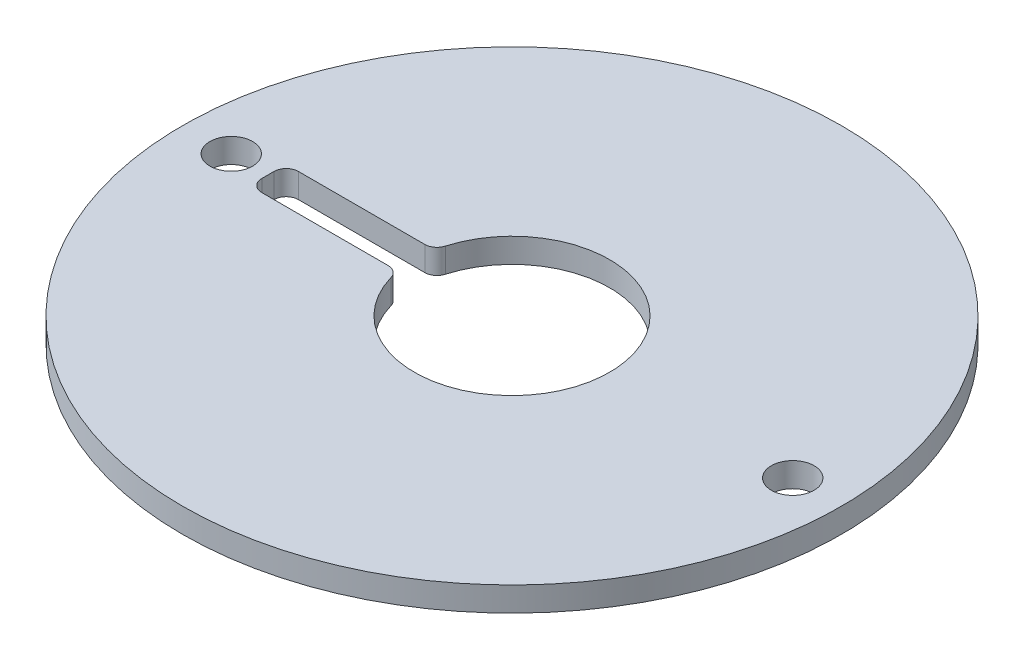
ISO-10303-21;
HEADER;
FILE_DESCRIPTION(('STEP AP214'),'2;1');
FILE_NAME('part.step','',(''),(''),'','','');
FILE_SCHEMA(('AUTOMOTIVE_DESIGN { 1 0 10303 214 1 1 1 1 }'));
ENDSEC;
DATA;
#1=APPLICATION_CONTEXT('core data for automotive mechanical design processes');
#2=APPLICATION_PROTOCOL_DEFINITION('international standard','automotive_design',2000,#1);
#3=PRODUCT_CONTEXT('',#1,'mechanical');
#4=PRODUCT('Part','Part','',(#3));
#5=PRODUCT_RELATED_PRODUCT_CATEGORY('part','',(#4));
#6=PRODUCT_DEFINITION_FORMATION('','',#4);
#7=PRODUCT_DEFINITION_CONTEXT('part definition',#1,'design');
#8=PRODUCT_DEFINITION('design','',#6,#7);
#9=PRODUCT_DEFINITION_SHAPE('','',#8);
#10=(LENGTH_UNIT() NAMED_UNIT(*) SI_UNIT(.MILLI.,.METRE.));
#11=(NAMED_UNIT(*) PLANE_ANGLE_UNIT() SI_UNIT($,.RADIAN.));
#12=(NAMED_UNIT(*) SI_UNIT($,.STERADIAN.) SOLID_ANGLE_UNIT());
#13=UNCERTAINTY_MEASURE_WITH_UNIT(LENGTH_MEASURE(1.E-05),#10,'distance_accuracy_value','');
#14=(GEOMETRIC_REPRESENTATION_CONTEXT(3) GLOBAL_UNCERTAINTY_ASSIGNED_CONTEXT((#13)) GLOBAL_UNIT_ASSIGNED_CONTEXT((#10,
#11,#12)) REPRESENTATION_CONTEXT('',''));
#15=CARTESIAN_POINT('',(0.,0.,0.));
#16=DIRECTION('',(0.,0.,1.));
#17=DIRECTION('',(1.,0.,0.));
#18=AXIS2_PLACEMENT_3D('',#15,#16,#17);
#19=CARTESIAN_POINT('',(0.,2.,0.));
#20=DIRECTION('',(0.,1.,0.));
#21=DIRECTION('',(0.,0.,1.));
#22=AXIS2_PLACEMENT_3D('',#19,#20,#21);
#23=PLANE('',#22);
#24=CARTESIAN_POINT('',(0.,2.,0.));
#25=DIRECTION('',(0.,1.,0.));
#26=DIRECTION('',(0.,0.,1.));
#27=AXIS2_PLACEMENT_3D('',#24,#25,#26);
#28=CIRCLE('',#27,8.);
#29=CARTESIAN_POINT('',(-7.6851628736847,2.,2.22222222222222));
#30=VERTEX_POINT('',#29);
#31=CARTESIAN_POINT('',(-7.6851628736847,2.,-2.22222222222222));
#32=VERTEX_POINT('',#31);
#33=EDGE_CURVE('E184',#30,#32,#28,.T.);
#34=ORIENTED_EDGE('',*,*,#33,.F.);
#35=CARTESIAN_POINT('',(-8.64580823289529,2.,2.5));
#36=DIRECTION('',(0.,1.,0.));
#37=DIRECTION('',(0.,0.,1.));
#38=AXIS2_PLACEMENT_3D('',#35,#36,#37);
#39=CIRCLE('',#38,1.);
#40=CARTESIAN_POINT('',(-8.64580823289529,2.,1.5));
#41=VERTEX_POINT('',#40);
#42=EDGE_CURVE('E139',#30,#41,#39,.T.);
#43=ORIENTED_EDGE('',*,*,#42,.T.);
#44=DIRECTION('',(1.,0.,0.));
#45=VECTOR('',#44,1.);
#46=CARTESIAN_POINT('',(-20.,2.,1.5));
#47=LINE('',#46,#45);
#48=CARTESIAN_POINT('',(-19.,2.,1.5));
#49=VERTEX_POINT('',#48);
#50=EDGE_CURVE('E161',#49,#41,#47,.T.);
#51=ORIENTED_EDGE('',*,*,#50,.F.);
#52=CARTESIAN_POINT('',(-19.,2.,0.5));
#53=DIRECTION('',(0.,1.,0.));
#54=DIRECTION('',(0.,0.,1.));
#55=AXIS2_PLACEMENT_3D('',#52,#53,#54);
#56=CIRCLE('',#55,1.);
#57=CARTESIAN_POINT('',(-20.,2.,0.5));
#58=VERTEX_POINT('',#57);
#59=EDGE_CURVE('E48',#49,#58,#56,.F.);
#60=ORIENTED_EDGE('',*,*,#59,.T.);
#61=DIRECTION('',(0.,0.,1.));
#62=VECTOR('',#61,1.);
#63=CARTESIAN_POINT('',(-20.,2.,-1.5));
#64=LINE('',#63,#62);
#65=CARTESIAN_POINT('',(-20.,2.,-0.5));
#66=VERTEX_POINT('',#65);
#67=EDGE_CURVE('E155',#66,#58,#64,.T.);
#68=ORIENTED_EDGE('',*,*,#67,.F.);
#69=CARTESIAN_POINT('',(-19.,2.,-0.5));
#70=DIRECTION('',(0.,1.,0.));
#71=DIRECTION('',(0.,0.,1.));
#72=AXIS2_PLACEMENT_3D('',#69,#70,#71);
#73=CIRCLE('',#72,1.);
#74=CARTESIAN_POINT('',(-19.,2.,-1.5));
#75=VERTEX_POINT('',#74);
#76=EDGE_CURVE('E41',#66,#75,#73,.F.);
#77=ORIENTED_EDGE('',*,*,#76,.T.);
#78=DIRECTION('',(-1.,0.,0.));
#79=VECTOR('',#78,1.);
#80=CARTESIAN_POINT('',(-20.,2.,-1.5));
#81=LINE('',#80,#79);
#82=CARTESIAN_POINT('',(-8.64580823289529,2.,-1.5));
#83=VERTEX_POINT('',#82);
#84=EDGE_CURVE('E154',#83,#75,#81,.T.);
#85=ORIENTED_EDGE('',*,*,#84,.F.);
#86=CARTESIAN_POINT('',(-8.64580823289529,2.,-2.5));
#87=DIRECTION('',(0.,1.,0.));
#88=DIRECTION('',(0.,0.,1.));
#89=AXIS2_PLACEMENT_3D('',#86,#87,#88);
#90=CIRCLE('',#89,1.);
#91=EDGE_CURVE('E137',#83,#32,#90,.T.);
#92=ORIENTED_EDGE('',*,*,#91,.T.);
#93=EDGE_LOOP('',(#34,#43,#51,#60,#68,#77,#85,#92));
#94=FACE_BOUND('',#93,.T.);
#95=CARTESIAN_POINT('',(-23.,2.,0.));
#96=DIRECTION('',(0.,1.,0.));
#97=DIRECTION('',(0.,0.,1.));
#98=AXIS2_PLACEMENT_3D('',#95,#96,#97);
#99=CIRCLE('',#98,1.75);
#100=CARTESIAN_POINT('',(-23.,2.,1.75));
#101=VERTEX_POINT('',#100);
#102=EDGE_CURVE('E178',#101,#101,#99,.T.);
#103=ORIENTED_EDGE('',*,*,#102,.F.);
#104=EDGE_LOOP('',(#103));
#105=FACE_BOUND('',#104,.T.);
#106=CARTESIAN_POINT('',(0.,2.,0.));
#107=DIRECTION('',(0.,1.,0.));
#108=DIRECTION('',(0.,0.,1.));
#109=AXIS2_PLACEMENT_3D('',#106,#107,#108);
#110=CIRCLE('',#109,27.);
#111=CARTESIAN_POINT('',(0.,2.,27.));
#112=VERTEX_POINT('',#111);
#113=EDGE_CURVE('E121',#112,#112,#110,.T.);
#114=ORIENTED_EDGE('',*,*,#113,.T.);
#115=EDGE_LOOP('',(#114));
#116=FACE_BOUND('',#115,.T.);
#117=CARTESIAN_POINT('',(23.,2.,0.));
#118=DIRECTION('',(0.,1.,0.));
#119=DIRECTION('',(0.,0.,1.));
#120=AXIS2_PLACEMENT_3D('',#117,#118,#119);
#121=CIRCLE('',#120,1.75);
#122=CARTESIAN_POINT('',(23.,2.,1.75));
#123=VERTEX_POINT('',#122);
#124=EDGE_CURVE('E172',#123,#123,#121,.T.);
#125=ORIENTED_EDGE('',*,*,#124,.F.);
#126=EDGE_LOOP('',(#125));
#127=FACE_BOUND('',#126,.T.);
#128=ADVANCED_FACE('F33',(#94,#105,#116,#127),#23,.T.);
#129=CARTESIAN_POINT('',(0.,0.,0.));
#130=DIRECTION('',(0.,1.,0.));
#131=DIRECTION('',(0.,0.,1.));
#132=AXIS2_PLACEMENT_3D('',#129,#130,#131);
#133=PLANE('',#132);
#134=CARTESIAN_POINT('',(0.,0.,0.));
#135=DIRECTION('',(0.,1.,0.));
#136=DIRECTION('',(0.,0.,1.));
#137=AXIS2_PLACEMENT_3D('',#134,#135,#136);
#138=CIRCLE('',#137,27.);
#139=CARTESIAN_POINT('',(0.,0.,27.));
#140=VERTEX_POINT('',#139);
#141=EDGE_CURVE('E126',#140,#140,#138,.T.);
#142=ORIENTED_EDGE('',*,*,#141,.F.);
#143=EDGE_LOOP('',(#142));
#144=FACE_BOUND('',#143,.T.);
#145=DIRECTION('',(1.,0.,0.));
#146=VECTOR('',#145,1.);
#147=CARTESIAN_POINT('',(-20.,0.,1.5));
#148=LINE('',#147,#146);
#149=CARTESIAN_POINT('',(-19.,0.,1.5));
#150=VERTEX_POINT('',#149);
#151=CARTESIAN_POINT('',(-8.64580823289529,0.,1.5));
#152=VERTEX_POINT('',#151);
#153=EDGE_CURVE('E103',#150,#152,#148,.T.);
#154=ORIENTED_EDGE('',*,*,#153,.T.);
#155=CARTESIAN_POINT('',(-8.64580823289529,0.,2.5));
#156=DIRECTION('',(0.,1.,0.));
#157=DIRECTION('',(0.,0.,1.));
#158=AXIS2_PLACEMENT_3D('',#155,#156,#157);
#159=CIRCLE('',#158,1.);
#160=CARTESIAN_POINT('',(-7.6851628736847,0.,2.22222222222222));
#161=VERTEX_POINT('',#160);
#162=EDGE_CURVE('E131',#152,#161,#159,.F.);
#163=ORIENTED_EDGE('',*,*,#162,.T.);
#164=CARTESIAN_POINT('',(0.,0.,0.));
#165=DIRECTION('',(0.,1.,0.));
#166=DIRECTION('',(0.,0.,1.));
#167=AXIS2_PLACEMENT_3D('',#164,#165,#166);
#168=CIRCLE('',#167,8.);
#169=CARTESIAN_POINT('',(-7.6851628736847,0.,-2.22222222222222));
#170=VERTEX_POINT('',#169);
#171=EDGE_CURVE('E181',#161,#170,#168,.T.);
#172=ORIENTED_EDGE('',*,*,#171,.T.);
#173=CARTESIAN_POINT('',(-8.64580823289529,0.,-2.5));
#174=DIRECTION('',(0.,1.,0.));
#175=DIRECTION('',(0.,0.,1.));
#176=AXIS2_PLACEMENT_3D('',#173,#174,#175);
#177=CIRCLE('',#176,1.);
#178=CARTESIAN_POINT('',(-8.64580823289529,0.,-1.5));
#179=VERTEX_POINT('',#178);
#180=EDGE_CURVE('E123',#170,#179,#177,.F.);
#181=ORIENTED_EDGE('',*,*,#180,.T.);
#182=DIRECTION('',(-1.,0.,0.));
#183=VECTOR('',#182,1.);
#184=CARTESIAN_POINT('',(-20.,0.,-1.5));
#185=LINE('',#184,#183);
#186=CARTESIAN_POINT('',(-19.,0.,-1.5));
#187=VERTEX_POINT('',#186);
#188=EDGE_CURVE('E118',#179,#187,#185,.T.);
#189=ORIENTED_EDGE('',*,*,#188,.T.);
#190=CARTESIAN_POINT('',(-19.,0.,-0.5));
#191=DIRECTION('',(0.,1.,0.));
#192=DIRECTION('',(0.,0.,1.));
#193=AXIS2_PLACEMENT_3D('',#190,#191,#192);
#194=CIRCLE('',#193,1.);
#195=CARTESIAN_POINT('',(-20.,0.,-0.5));
#196=VERTEX_POINT('',#195);
#197=EDGE_CURVE('E11',#187,#196,#194,.T.);
#198=ORIENTED_EDGE('',*,*,#197,.T.);
#199=DIRECTION('',(0.,0.,1.));
#200=VECTOR('',#199,1.);
#201=CARTESIAN_POINT('',(-20.,0.,-1.5));
#202=LINE('',#201,#200);
#203=CARTESIAN_POINT('',(-20.,0.,0.5));
#204=VERTEX_POINT('',#203);
#205=EDGE_CURVE('E105',#196,#204,#202,.T.);
#206=ORIENTED_EDGE('',*,*,#205,.T.);
#207=CARTESIAN_POINT('',(-19.,0.,0.5));
#208=DIRECTION('',(0.,1.,0.));
#209=DIRECTION('',(0.,0.,1.));
#210=AXIS2_PLACEMENT_3D('',#207,#208,#209);
#211=CIRCLE('',#210,1.);
#212=EDGE_CURVE('E99',#204,#150,#211,.T.);
#213=ORIENTED_EDGE('',*,*,#212,.T.);
#214=EDGE_LOOP('',(#154,#163,#172,#181,#189,#198,#206,#213));
#215=FACE_BOUND('',#214,.T.);
#216=CARTESIAN_POINT('',(-23.,0.,0.));
#217=DIRECTION('',(0.,1.,0.));
#218=DIRECTION('',(0.,0.,1.));
#219=AXIS2_PLACEMENT_3D('',#216,#217,#218);
#220=CIRCLE('',#219,1.75);
#221=CARTESIAN_POINT('',(-23.,0.,1.75));
#222=VERTEX_POINT('',#221);
#223=EDGE_CURVE('E175',#222,#222,#220,.T.);
#224=ORIENTED_EDGE('',*,*,#223,.T.);
#225=EDGE_LOOP('',(#224));
#226=FACE_BOUND('',#225,.T.);
#227=CARTESIAN_POINT('',(23.,0.,0.));
#228=DIRECTION('',(0.,1.,0.));
#229=DIRECTION('',(0.,0.,1.));
#230=AXIS2_PLACEMENT_3D('',#227,#228,#229);
#231=CIRCLE('',#230,1.75);
#232=CARTESIAN_POINT('',(23.,0.,1.75));
#233=VERTEX_POINT('',#232);
#234=EDGE_CURVE('E169',#233,#233,#231,.T.);
#235=ORIENTED_EDGE('',*,*,#234,.T.);
#236=EDGE_LOOP('',(#235));
#237=FACE_BOUND('',#236,.T.);
#238=ADVANCED_FACE('F101',(#144,#215,#226,#237),#133,.F.);
#239=CARTESIAN_POINT('',(0.,2.,0.));
#240=DIRECTION('',(0.,-1.,0.));
#241=DIRECTION('',(0.,0.,-1.));
#242=AXIS2_PLACEMENT_3D('',#239,#240,#241);
#243=CYLINDRICAL_SURFACE('',#242,27.);
#244=ORIENTED_EDGE('',*,*,#113,.F.);
#245=EDGE_LOOP('',(#244));
#246=FACE_BOUND('',#245,.T.);
#247=ORIENTED_EDGE('',*,*,#141,.T.);
#248=EDGE_LOOP('',(#247));
#249=FACE_BOUND('',#248,.T.);
#250=ADVANCED_FACE('F214',(#246,#249),#243,.T.);
#251=CARTESIAN_POINT('',(0.,2.,0.));
#252=DIRECTION('',(0.,-1.,0.));
#253=DIRECTION('',(0.,0.,-1.));
#254=AXIS2_PLACEMENT_3D('',#251,#252,#253);
#255=CYLINDRICAL_SURFACE('',#254,8.);
#256=ORIENTED_EDGE('',*,*,#171,.F.);
#257=DIRECTION('',(0.,-1.,0.));
#258=VECTOR('',#257,1.);
#259=CARTESIAN_POINT('',(-7.6851628736847,2.,2.22222222222222));
#260=LINE('',#259,#258);
#261=EDGE_CURVE('E135',#161,#30,#260,.F.);
#262=ORIENTED_EDGE('',*,*,#261,.T.);
#263=ORIENTED_EDGE('',*,*,#33,.T.);
#264=DIRECTION('',(0.,-1.,0.));
#265=VECTOR('',#264,1.);
#266=CARTESIAN_POINT('',(-7.6851628736847,2.,-2.22222222222222));
#267=LINE('',#266,#265);
#268=EDGE_CURVE('E133',#32,#170,#267,.T.);
#269=ORIENTED_EDGE('',*,*,#268,.T.);
#270=EDGE_LOOP('',(#256,#262,#263,#269));
#271=FACE_BOUND('',#270,.T.);
#272=ADVANCED_FACE('F196',(#271),#255,.F.);
#273=CARTESIAN_POINT('',(-23.,2.,0.));
#274=DIRECTION('',(0.,-1.,0.));
#275=DIRECTION('',(0.,0.,-1.));
#276=AXIS2_PLACEMENT_3D('',#273,#274,#275);
#277=CYLINDRICAL_SURFACE('',#276,1.75);
#278=ORIENTED_EDGE('',*,*,#102,.T.);
#279=EDGE_LOOP('',(#278));
#280=FACE_BOUND('',#279,.T.);
#281=ORIENTED_EDGE('',*,*,#223,.F.);
#282=EDGE_LOOP('',(#281));
#283=FACE_BOUND('',#282,.T.);
#284=ADVANCED_FACE('F226',(#280,#283),#277,.F.);
#285=CARTESIAN_POINT('',(23.,2.,0.));
#286=DIRECTION('',(0.,-1.,0.));
#287=DIRECTION('',(0.,0.,-1.));
#288=AXIS2_PLACEMENT_3D('',#285,#286,#287);
#289=CYLINDRICAL_SURFACE('',#288,1.75);
#290=ORIENTED_EDGE('',*,*,#124,.T.);
#291=EDGE_LOOP('',(#290));
#292=FACE_BOUND('',#291,.T.);
#293=ORIENTED_EDGE('',*,*,#234,.F.);
#294=EDGE_LOOP('',(#293));
#295=FACE_BOUND('',#294,.T.);
#296=ADVANCED_FACE('F235',(#292,#295),#289,.F.);
#297=CARTESIAN_POINT('',(-20.,0.,-1.5));
#298=DIRECTION('',(-1.,0.,0.));
#299=DIRECTION('',(0.,0.,1.));
#300=AXIS2_PLACEMENT_3D('',#297,#298,#299);
#301=PLANE('',#300);
#302=ORIENTED_EDGE('',*,*,#67,.T.);
#303=DIRECTION('',(0.,1.,0.));
#304=VECTOR('',#303,1.);
#305=CARTESIAN_POINT('',(-20.,0.,0.5));
#306=LINE('',#305,#304);
#307=EDGE_CURVE('E148',#58,#204,#306,.F.);
#308=ORIENTED_EDGE('',*,*,#307,.T.);
#309=ORIENTED_EDGE('',*,*,#205,.F.);
#310=DIRECTION('',(0.,1.,0.));
#311=VECTOR('',#310,1.);
#312=CARTESIAN_POINT('',(-20.,2.,-0.5));
#313=LINE('',#312,#311);
#314=EDGE_CURVE('E146',#196,#66,#313,.T.);
#315=ORIENTED_EDGE('',*,*,#314,.T.);
#316=EDGE_LOOP('',(#302,#308,#309,#315));
#317=FACE_BOUND('',#316,.T.);
#318=ADVANCED_FACE('F165',(#317),#301,.F.);
#319=CARTESIAN_POINT('',(-20.,0.,-1.5));
#320=DIRECTION('',(0.,0.,-1.));
#321=DIRECTION('',(-1.,0.,0.));
#322=AXIS2_PLACEMENT_3D('',#319,#320,#321);
#323=PLANE('',#322);
#324=ORIENTED_EDGE('',*,*,#188,.F.);
#325=DIRECTION('',(0.,1.,0.));
#326=VECTOR('',#325,1.);
#327=CARTESIAN_POINT('',(-8.64580823289529,2.,-1.5));
#328=LINE('',#327,#326);
#329=EDGE_CURVE('E143',#179,#83,#328,.T.);
#330=ORIENTED_EDGE('',*,*,#329,.T.);
#331=ORIENTED_EDGE('',*,*,#84,.T.);
#332=DIRECTION('',(0.,1.,0.));
#333=VECTOR('',#332,1.);
#334=CARTESIAN_POINT('',(-19.,0.,-1.5));
#335=LINE('',#334,#333);
#336=EDGE_CURVE('E141',#75,#187,#335,.F.);
#337=ORIENTED_EDGE('',*,*,#336,.T.);
#338=EDGE_LOOP('',(#324,#330,#331,#337));
#339=FACE_BOUND('',#338,.T.);
#340=ADVANCED_FACE('F158',(#339),#323,.F.);
#341=CARTESIAN_POINT('',(-20.,0.,1.5));
#342=DIRECTION('',(0.,0.,1.));
#343=DIRECTION('',(1.,0.,0.));
#344=AXIS2_PLACEMENT_3D('',#341,#342,#343);
#345=PLANE('',#344);
#346=ORIENTED_EDGE('',*,*,#50,.T.);
#347=DIRECTION('',(0.,1.,0.));
#348=VECTOR('',#347,1.);
#349=CARTESIAN_POINT('',(-8.64580823289529,0.,1.5));
#350=LINE('',#349,#348);
#351=EDGE_CURVE('E117',#41,#152,#350,.F.);
#352=ORIENTED_EDGE('',*,*,#351,.T.);
#353=ORIENTED_EDGE('',*,*,#153,.F.);
#354=DIRECTION('',(0.,1.,0.));
#355=VECTOR('',#354,1.);
#356=CARTESIAN_POINT('',(-19.,2.,1.5));
#357=LINE('',#356,#355);
#358=EDGE_CURVE('E115',#150,#49,#357,.T.);
#359=ORIENTED_EDGE('',*,*,#358,.T.);
#360=EDGE_LOOP('',(#346,#352,#353,#359));
#361=FACE_BOUND('',#360,.T.);
#362=ADVANCED_FACE('F114',(#361),#345,.F.);
#363=CARTESIAN_POINT('',(-8.64580823289529,2.,2.5));
#364=DIRECTION('',(0.,-1.,0.));
#365=DIRECTION('',(0.,0.,-1.));
#366=AXIS2_PLACEMENT_3D('',#363,#364,#365);
#367=CYLINDRICAL_SURFACE('',#366,1.);
#368=ORIENTED_EDGE('',*,*,#42,.F.);
#369=ORIENTED_EDGE('',*,*,#261,.F.);
#370=ORIENTED_EDGE('',*,*,#162,.F.);
#371=ORIENTED_EDGE('',*,*,#351,.F.);
#372=EDGE_LOOP('',(#368,#369,#370,#371));
#373=FACE_BOUND('',#372,.T.);
#374=ADVANCED_FACE('F198',(#373),#367,.T.);
#375=CARTESIAN_POINT('',(-8.64580823289529,2.,-2.5));
#376=DIRECTION('',(0.,-1.,0.));
#377=DIRECTION('',(0.,0.,-1.));
#378=AXIS2_PLACEMENT_3D('',#375,#376,#377);
#379=CYLINDRICAL_SURFACE('',#378,1.);
#380=ORIENTED_EDGE('',*,*,#180,.F.);
#381=ORIENTED_EDGE('',*,*,#268,.F.);
#382=ORIENTED_EDGE('',*,*,#91,.F.);
#383=ORIENTED_EDGE('',*,*,#329,.F.);
#384=EDGE_LOOP('',(#380,#381,#382,#383));
#385=FACE_BOUND('',#384,.T.);
#386=ADVANCED_FACE('F194',(#385),#379,.T.);
#387=CARTESIAN_POINT('',(-19.,0.,0.5));
#388=DIRECTION('',(0.,-1.,0.));
#389=DIRECTION('',(0.,0.,-1.));
#390=AXIS2_PLACEMENT_3D('',#387,#388,#389);
#391=CYLINDRICAL_SURFACE('',#390,1.);
#392=ORIENTED_EDGE('',*,*,#212,.F.);
#393=ORIENTED_EDGE('',*,*,#307,.F.);
#394=ORIENTED_EDGE('',*,*,#59,.F.);
#395=ORIENTED_EDGE('',*,*,#358,.F.);
#396=EDGE_LOOP('',(#392,#393,#394,#395));
#397=FACE_BOUND('',#396,.T.);
#398=ADVANCED_FACE('F120',(#397),#391,.F.);
#399=CARTESIAN_POINT('',(-19.,0.,-0.5));
#400=DIRECTION('',(0.,-1.,0.));
#401=DIRECTION('',(0.,0.,-1.));
#402=AXIS2_PLACEMENT_3D('',#399,#400,#401);
#403=CYLINDRICAL_SURFACE('',#402,1.);
#404=ORIENTED_EDGE('',*,*,#197,.F.);
#405=ORIENTED_EDGE('',*,*,#336,.F.);
#406=ORIENTED_EDGE('',*,*,#76,.F.);
#407=ORIENTED_EDGE('',*,*,#314,.F.);
#408=EDGE_LOOP('',(#404,#405,#406,#407));
#409=FACE_BOUND('',#408,.T.);
#410=ADVANCED_FACE('F35',(#409),#403,.F.);
#411=CLOSED_SHELL('',(#128,#238,#250,#272,#284,#296,#318,#340,#362,#374,#386,#398,#410));
#412=MANIFOLD_SOLID_BREP('B2',#411);
#413=ADVANCED_BREP_SHAPE_REPRESENTATION('',(#18,#412),#14);
#414=SHAPE_DEFINITION_REPRESENTATION(#9,#413);
ENDSEC;
END-ISO-10303-21;
